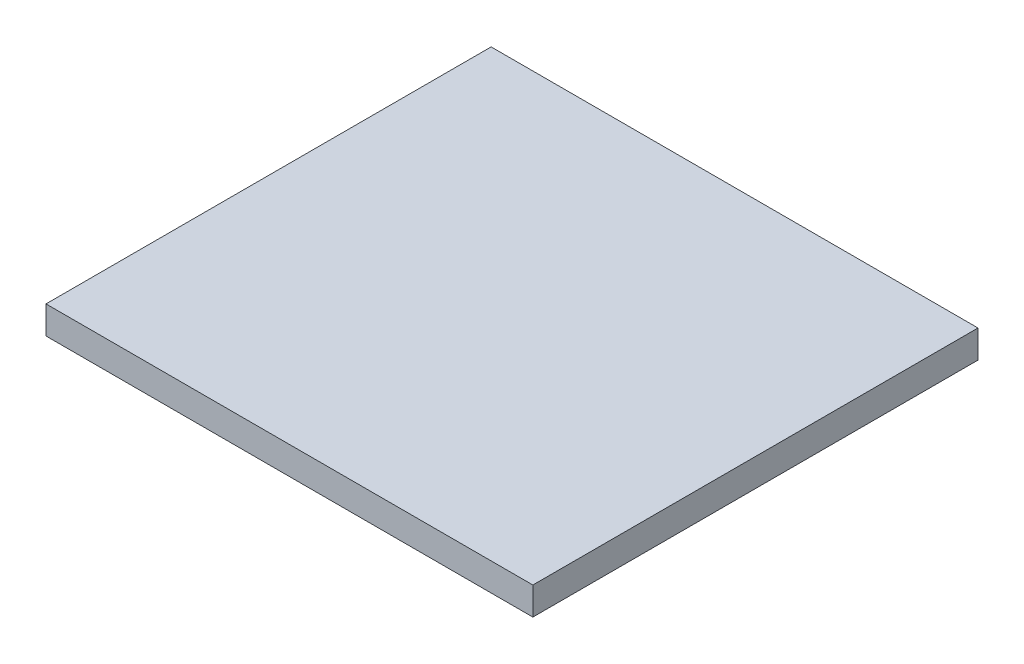
ISO-10303-21;
HEADER;
FILE_DESCRIPTION(('STEP AP214'),'2;1');
FILE_NAME('part.step','',(''),(''),'','','');
FILE_SCHEMA(('AUTOMOTIVE_DESIGN { 1 0 10303 214 1 1 1 1 }'));
ENDSEC;
DATA;
#1=APPLICATION_CONTEXT('core data for automotive mechanical design processes');
#2=APPLICATION_PROTOCOL_DEFINITION('international standard','automotive_design',2000,#1);
#3=PRODUCT_CONTEXT('',#1,'mechanical');
#4=PRODUCT('Part','Part','',(#3));
#5=PRODUCT_RELATED_PRODUCT_CATEGORY('part','',(#4));
#6=PRODUCT_DEFINITION_FORMATION('','',#4);
#7=PRODUCT_DEFINITION_CONTEXT('part definition',#1,'design');
#8=PRODUCT_DEFINITION('design','',#6,#7);
#9=PRODUCT_DEFINITION_SHAPE('','',#8);
#10=(LENGTH_UNIT() NAMED_UNIT(*) SI_UNIT(.MILLI.,.METRE.));
#11=(NAMED_UNIT(*) PLANE_ANGLE_UNIT() SI_UNIT($,.RADIAN.));
#12=(NAMED_UNIT(*) SI_UNIT($,.STERADIAN.) SOLID_ANGLE_UNIT());
#13=UNCERTAINTY_MEASURE_WITH_UNIT(LENGTH_MEASURE(1.E-05),#10,'distance_accuracy_value','');
#14=(GEOMETRIC_REPRESENTATION_CONTEXT(3) GLOBAL_UNCERTAINTY_ASSIGNED_CONTEXT((#13)) GLOBAL_UNIT_ASSIGNED_CONTEXT((#10,
#11,#12)) REPRESENTATION_CONTEXT('',''));
#15=CARTESIAN_POINT('',(0.,0.,0.));
#16=DIRECTION('',(0.,0.,1.));
#17=DIRECTION('',(1.,0.,0.));
#18=AXIS2_PLACEMENT_3D('',#15,#16,#17);
#19=CARTESIAN_POINT('',(50.1888888888889,7.35555555555552,8.25));
#20=DIRECTION('',(1.,0.,0.));
#21=DIRECTION('',(0.,1.,0.));
#22=AXIS2_PLACEMENT_3D('',#19,#20,#21);
#23=PLANE('',#22);
#24=DIRECTION('',(0.,0.,-1.));
#25=VECTOR('',#24,1.);
#26=CARTESIAN_POINT('',(50.1888888888889,8.35555555555552,8.25));
#27=LINE('',#26,#25);
#28=CARTESIAN_POINT('',(50.1888888888889,8.35555555555552,8.25));
#29=VERTEX_POINT('',#28);
#30=CARTESIAN_POINT('',(50.1888888888889,8.35555555555558,-7.75));
#31=VERTEX_POINT('',#30);
#32=EDGE_CURVE('E98',#29,#31,#27,.T.);
#33=ORIENTED_EDGE('',*,*,#32,.T.);
#34=DIRECTION('',(0.,1.,0.));
#35=VECTOR('',#34,1.);
#36=CARTESIAN_POINT('',(50.1888888888889,7.35555555555558,-7.75));
#37=LINE('',#36,#35);
#38=CARTESIAN_POINT('',(50.1888888888889,7.35555555555558,-7.75));
#39=VERTEX_POINT('',#38);
#40=EDGE_CURVE('E11',#39,#31,#37,.T.);
#41=ORIENTED_EDGE('',*,*,#40,.F.);
#42=DIRECTION('',(0.,0.,-1.));
#43=VECTOR('',#42,1.);
#44=CARTESIAN_POINT('',(50.1888888888889,7.35555555555552,8.25));
#45=LINE('',#44,#43);
#46=CARTESIAN_POINT('',(50.1888888888889,7.35555555555552,8.25));
#47=VERTEX_POINT('',#46);
#48=EDGE_CURVE('E86',#47,#39,#45,.T.);
#49=ORIENTED_EDGE('',*,*,#48,.F.);
#50=DIRECTION('',(0.,1.,0.));
#51=VECTOR('',#50,1.);
#52=CARTESIAN_POINT('',(50.1888888888889,7.35555555555552,8.25));
#53=LINE('',#52,#51);
#54=EDGE_CURVE('E94',#47,#29,#53,.T.);
#55=ORIENTED_EDGE('',*,*,#54,.T.);
#56=EDGE_LOOP('',(#33,#41,#49,#55));
#57=FACE_BOUND('',#56,.T.);
#58=ADVANCED_FACE('F35',(#57),#23,.F.);
#59=CARTESIAN_POINT('',(50.1888888888889,7.35555555555558,-7.75));
#60=DIRECTION('',(0.,0.,1.));
#61=DIRECTION('',(0.,-1.,0.));
#62=AXIS2_PLACEMENT_3D('',#59,#60,#61);
#63=PLANE('',#62);
#64=DIRECTION('',(1.,0.,0.));
#65=VECTOR('',#64,1.);
#66=CARTESIAN_POINT('',(50.1888888888889,8.35555555555558,-7.75));
#67=LINE('',#66,#65);
#68=CARTESIAN_POINT('',(67.6888888888889,8.35555555555558,-7.75));
#69=VERTEX_POINT('',#68);
#70=EDGE_CURVE('E90',#31,#69,#67,.T.);
#71=ORIENTED_EDGE('',*,*,#70,.T.);
#72=DIRECTION('',(0.,1.,0.));
#73=VECTOR('',#72,1.);
#74=CARTESIAN_POINT('',(67.6888888888889,7.35555555555558,-7.75));
#75=LINE('',#74,#73);
#76=CARTESIAN_POINT('',(67.6888888888889,7.35555555555558,-7.75));
#77=VERTEX_POINT('',#76);
#78=EDGE_CURVE('E43',#77,#69,#75,.T.);
#79=ORIENTED_EDGE('',*,*,#78,.F.);
#80=DIRECTION('',(1.,0.,0.));
#81=VECTOR('',#80,1.);
#82=CARTESIAN_POINT('',(50.1888888888889,7.35555555555558,-7.75));
#83=LINE('',#82,#81);
#84=EDGE_CURVE('E81',#39,#77,#83,.T.);
#85=ORIENTED_EDGE('',*,*,#84,.F.);
#86=ORIENTED_EDGE('',*,*,#40,.T.);
#87=EDGE_LOOP('',(#71,#79,#85,#86));
#88=FACE_BOUND('',#87,.T.);
#89=ADVANCED_FACE('F89',(#88),#63,.F.);
#90=CARTESIAN_POINT('',(67.6888888888889,7.35555555555552,8.25));
#91=DIRECTION('',(-1.,0.,0.));
#92=DIRECTION('',(0.,0.,-1.));
#93=AXIS2_PLACEMENT_3D('',#90,#91,#92);
#94=PLANE('',#93);
#95=DIRECTION('',(0.,0.,1.));
#96=VECTOR('',#95,1.);
#97=CARTESIAN_POINT('',(67.6888888888889,8.35555555555552,8.25));
#98=LINE('',#97,#96);
#99=CARTESIAN_POINT('',(67.6888888888889,8.35555555555552,8.25));
#100=VERTEX_POINT('',#99);
#101=EDGE_CURVE('E68',#69,#100,#98,.T.);
#102=ORIENTED_EDGE('',*,*,#101,.T.);
#103=DIRECTION('',(0.,1.,0.));
#104=VECTOR('',#103,1.);
#105=CARTESIAN_POINT('',(67.6888888888889,7.35555555555552,8.25));
#106=LINE('',#105,#104);
#107=CARTESIAN_POINT('',(67.6888888888889,7.35555555555552,8.25));
#108=VERTEX_POINT('',#107);
#109=EDGE_CURVE('E91',#108,#100,#106,.T.);
#110=ORIENTED_EDGE('',*,*,#109,.F.);
#111=DIRECTION('',(0.,0.,1.));
#112=VECTOR('',#111,1.);
#113=CARTESIAN_POINT('',(67.6888888888889,7.35555555555552,8.25));
#114=LINE('',#113,#112);
#115=EDGE_CURVE('E84',#77,#108,#114,.T.);
#116=ORIENTED_EDGE('',*,*,#115,.F.);
#117=ORIENTED_EDGE('',*,*,#78,.T.);
#118=EDGE_LOOP('',(#102,#110,#116,#117));
#119=FACE_BOUND('',#118,.T.);
#120=ADVANCED_FACE('F92',(#119),#94,.F.);
#121=CARTESIAN_POINT('',(50.1888888888889,7.35555555555552,8.25));
#122=DIRECTION('',(0.,0.,-1.));
#123=DIRECTION('',(0.,1.,0.));
#124=AXIS2_PLACEMENT_3D('',#121,#122,#123);
#125=PLANE('',#124);
#126=DIRECTION('',(-1.,0.,0.));
#127=VECTOR('',#126,1.);
#128=CARTESIAN_POINT('',(50.1888888888889,8.35555555555552,8.25));
#129=LINE('',#128,#127);
#130=EDGE_CURVE('E74',#100,#29,#129,.T.);
#131=ORIENTED_EDGE('',*,*,#130,.T.);
#132=ORIENTED_EDGE('',*,*,#54,.F.);
#133=DIRECTION('',(-1.,0.,0.));
#134=VECTOR('',#133,1.);
#135=CARTESIAN_POINT('',(50.1888888888889,7.35555555555552,8.25));
#136=LINE('',#135,#134);
#137=EDGE_CURVE('E51',#108,#47,#136,.T.);
#138=ORIENTED_EDGE('',*,*,#137,.F.);
#139=ORIENTED_EDGE('',*,*,#109,.T.);
#140=EDGE_LOOP('',(#131,#132,#138,#139));
#141=FACE_BOUND('',#140,.T.);
#142=ADVANCED_FACE('F105',(#141),#125,.F.);
#143=CARTESIAN_POINT('',(0.,7.35555555555558,-7.85555555555555));
#144=DIRECTION('',(0.,-1.,0.));
#145=DIRECTION('',(1.,0.,0.));
#146=AXIS2_PLACEMENT_3D('',#143,#144,#145);
#147=PLANE('',#146);
#148=ORIENTED_EDGE('',*,*,#48,.T.);
#149=ORIENTED_EDGE('',*,*,#84,.T.);
#150=ORIENTED_EDGE('',*,*,#115,.T.);
#151=ORIENTED_EDGE('',*,*,#137,.T.);
#152=EDGE_LOOP('',(#148,#149,#150,#151));
#153=FACE_BOUND('',#152,.T.);
#154=ADVANCED_FACE('F82',(#153),#147,.T.);
#155=CARTESIAN_POINT('',(0.,8.35555555555558,-7.85555555555555));
#156=DIRECTION('',(0.,-1.,0.));
#157=DIRECTION('',(1.,0.,0.));
#158=AXIS2_PLACEMENT_3D('',#155,#156,#157);
#159=PLANE('',#158);
#160=ORIENTED_EDGE('',*,*,#32,.F.);
#161=ORIENTED_EDGE('',*,*,#130,.F.);
#162=ORIENTED_EDGE('',*,*,#101,.F.);
#163=ORIENTED_EDGE('',*,*,#70,.F.);
#164=EDGE_LOOP('',(#160,#161,#162,#163));
#165=FACE_BOUND('',#164,.T.);
#166=ADVANCED_FACE('F108',(#165),#159,.F.);
#167=CLOSED_SHELL('',(#58,#89,#120,#142,#154,#166));
#168=MANIFOLD_SOLID_BREP('B2',#167);
#169=ADVANCED_BREP_SHAPE_REPRESENTATION('',(#18,#168),#14);
#170=SHAPE_DEFINITION_REPRESENTATION(#9,#169);
ENDSEC;
END-ISO-10303-21;
